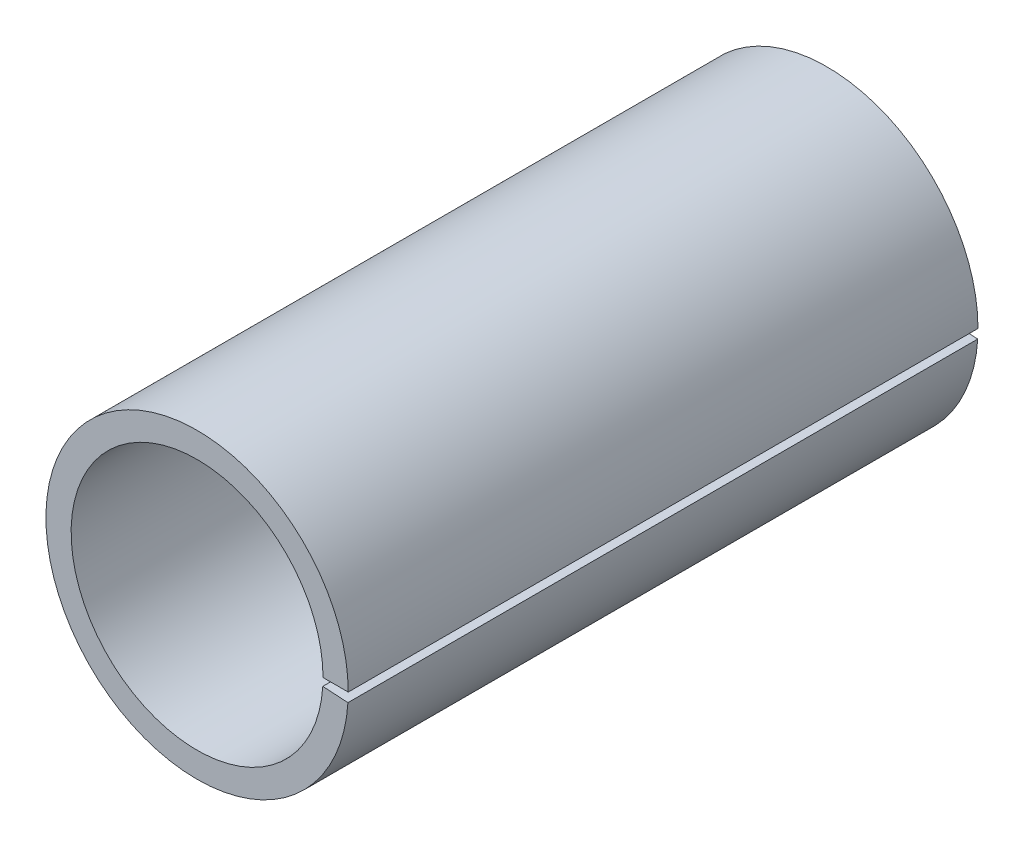
ISO-10303-21;
HEADER;
FILE_DESCRIPTION(('STEP AP214'),'2;1');
FILE_NAME('part.step','',(''),(''),'','','');
FILE_SCHEMA(('AUTOMOTIVE_DESIGN { 1 0 10303 214 1 1 1 1 }'));
ENDSEC;
DATA;
#1=APPLICATION_CONTEXT('core data for automotive mechanical design processes');
#2=APPLICATION_PROTOCOL_DEFINITION('international standard','automotive_design',2000,#1);
#3=PRODUCT_CONTEXT('',#1,'mechanical');
#4=PRODUCT('Part','Part','',(#3));
#5=PRODUCT_RELATED_PRODUCT_CATEGORY('part','',(#4));
#6=PRODUCT_DEFINITION_FORMATION('','',#4);
#7=PRODUCT_DEFINITION_CONTEXT('part definition',#1,'design');
#8=PRODUCT_DEFINITION('design','',#6,#7);
#9=PRODUCT_DEFINITION_SHAPE('','',#8);
#10=(LENGTH_UNIT() NAMED_UNIT(*) SI_UNIT(.MILLI.,.METRE.));
#11=(NAMED_UNIT(*) PLANE_ANGLE_UNIT() SI_UNIT($,.RADIAN.));
#12=(NAMED_UNIT(*) SI_UNIT($,.STERADIAN.) SOLID_ANGLE_UNIT());
#13=UNCERTAINTY_MEASURE_WITH_UNIT(LENGTH_MEASURE(1.E-05),#10,'distance_accuracy_value','');
#14=(GEOMETRIC_REPRESENTATION_CONTEXT(3) GLOBAL_UNCERTAINTY_ASSIGNED_CONTEXT((#13)) GLOBAL_UNIT_ASSIGNED_CONTEXT((#10,
#11,#12)) REPRESENTATION_CONTEXT('',''));
#15=CARTESIAN_POINT('',(0.,0.,0.));
#16=DIRECTION('',(0.,0.,1.));
#17=DIRECTION('',(1.,0.,0.));
#18=AXIS2_PLACEMENT_3D('',#15,#16,#17);
#19=CARTESIAN_POINT('',(0.,0.,25.));
#20=DIRECTION('',(0.,0.,1.));
#21=DIRECTION('',(1.,0.,0.));
#22=AXIS2_PLACEMENT_3D('',#19,#20,#21);
#23=PLANE('',#22);
#24=DIRECTION('',(0.998108793977972,-0.0614722326244827,0.));
#25=VECTOR('',#24,1.);
#26=CARTESIAN_POINT('',(0.,0.,25.));
#27=LINE('',#26,#25);
#28=CARTESIAN_POINT('',(4.99054396988986,-0.307361163122413,25.));
#29=VERTEX_POINT('',#28);
#30=CARTESIAN_POINT('',(5.98865276386783,-0.368833395746894,25.));
#31=VERTEX_POINT('',#30);
#32=EDGE_CURVE('E78',#29,#31,#27,.T.);
#33=ORIENTED_EDGE('',*,*,#32,.F.);
#34=CARTESIAN_POINT('',(0.,0.,25.));
#35=DIRECTION('',(0.,0.,1.));
#36=DIRECTION('',(1.,0.,0.));
#37=AXIS2_PLACEMENT_3D('',#34,#35,#36);
#38=CIRCLE('',#37,5.);
#39=CARTESIAN_POINT('',(5.,0.,25.));
#40=VERTEX_POINT('',#39);
#41=EDGE_CURVE('E102',#40,#29,#38,.T.);
#42=ORIENTED_EDGE('',*,*,#41,.F.);
#43=DIRECTION('',(-1.,0.,0.));
#44=VECTOR('',#43,1.);
#45=CARTESIAN_POINT('',(0.,0.,25.));
#46=LINE('',#45,#44);
#47=CARTESIAN_POINT('',(6.,0.,25.));
#48=VERTEX_POINT('',#47);
#49=EDGE_CURVE('E62',#48,#40,#46,.T.);
#50=ORIENTED_EDGE('',*,*,#49,.F.);
#51=CARTESIAN_POINT('',(0.,0.,25.));
#52=DIRECTION('',(0.,0.,1.));
#53=DIRECTION('',(1.,0.,0.));
#54=AXIS2_PLACEMENT_3D('',#51,#52,#53);
#55=CIRCLE('',#54,6.);
#56=EDGE_CURVE('E92',#48,#31,#55,.T.);
#57=ORIENTED_EDGE('',*,*,#56,.T.);
#58=EDGE_LOOP('',(#33,#42,#50,#57));
#59=FACE_BOUND('',#58,.T.);
#60=ADVANCED_FACE('F39',(#59),#23,.T.);
#61=CARTESIAN_POINT('',(0.,0.,0.));
#62=DIRECTION('',(0.,0.,1.));
#63=DIRECTION('',(1.,0.,0.));
#64=AXIS2_PLACEMENT_3D('',#61,#62,#63);
#65=PLANE('',#64);
#66=CARTESIAN_POINT('',(0.,0.,0.));
#67=DIRECTION('',(0.,0.,1.));
#68=DIRECTION('',(1.,0.,0.));
#69=AXIS2_PLACEMENT_3D('',#66,#67,#68);
#70=CIRCLE('',#69,5.);
#71=CARTESIAN_POINT('',(5.,0.,0.));
#72=VERTEX_POINT('',#71);
#73=CARTESIAN_POINT('',(4.99054396988986,-0.307361163122413,0.));
#74=VERTEX_POINT('',#73);
#75=EDGE_CURVE('E105',#72,#74,#70,.T.);
#76=ORIENTED_EDGE('',*,*,#75,.T.);
#77=DIRECTION('',(0.998108793977972,-0.0614722326244827,0.));
#78=VECTOR('',#77,1.);
#79=CARTESIAN_POINT('',(0.,0.,0.));
#80=LINE('',#79,#78);
#81=CARTESIAN_POINT('',(5.98865276386783,-0.368833395746894,0.));
#82=VERTEX_POINT('',#81);
#83=EDGE_CURVE('E54',#74,#82,#80,.T.);
#84=ORIENTED_EDGE('',*,*,#83,.T.);
#85=CARTESIAN_POINT('',(0.,0.,0.));
#86=DIRECTION('',(0.,0.,1.));
#87=DIRECTION('',(1.,0.,0.));
#88=AXIS2_PLACEMENT_3D('',#85,#86,#87);
#89=CIRCLE('',#88,6.);
#90=CARTESIAN_POINT('',(6.,0.,0.));
#91=VERTEX_POINT('',#90);
#92=EDGE_CURVE('E94',#91,#82,#89,.T.);
#93=ORIENTED_EDGE('',*,*,#92,.F.);
#94=DIRECTION('',(-1.,0.,0.));
#95=VECTOR('',#94,1.);
#96=CARTESIAN_POINT('',(0.,0.,0.));
#97=LINE('',#96,#95);
#98=EDGE_CURVE('E113',#91,#72,#97,.T.);
#99=ORIENTED_EDGE('',*,*,#98,.T.);
#100=EDGE_LOOP('',(#76,#84,#93,#99));
#101=FACE_BOUND('',#100,.T.);
#102=ADVANCED_FACE('F122',(#101),#65,.F.);
#103=CARTESIAN_POINT('',(0.,0.,25.));
#104=DIRECTION('',(0.,0.,-1.));
#105=DIRECTION('',(-1.,0.,0.));
#106=AXIS2_PLACEMENT_3D('',#103,#104,#105);
#107=CYLINDRICAL_SURFACE('',#106,6.);
#108=ORIENTED_EDGE('',*,*,#92,.T.);
#109=DIRECTION('',(0.,0.,1.));
#110=VECTOR('',#109,1.);
#111=CARTESIAN_POINT('',(5.98865276386783,-0.368833395746894,-5.));
#112=LINE('',#111,#110);
#113=EDGE_CURVE('E81',#82,#31,#112,.T.);
#114=ORIENTED_EDGE('',*,*,#113,.T.);
#115=ORIENTED_EDGE('',*,*,#56,.F.);
#116=DIRECTION('',(0.,0.,1.));
#117=VECTOR('',#116,1.);
#118=CARTESIAN_POINT('',(6.,0.,-5.));
#119=LINE('',#118,#117);
#120=EDGE_CURVE('E96',#91,#48,#119,.T.);
#121=ORIENTED_EDGE('',*,*,#120,.F.);
#122=EDGE_LOOP('',(#108,#114,#115,#121));
#123=FACE_BOUND('',#122,.T.);
#124=ADVANCED_FACE('F41',(#123),#107,.T.);
#125=CARTESIAN_POINT('',(0.,0.,25.));
#126=DIRECTION('',(0.,0.,-1.));
#127=DIRECTION('',(-1.,0.,0.));
#128=AXIS2_PLACEMENT_3D('',#125,#126,#127);
#129=CYLINDRICAL_SURFACE('',#128,5.);
#130=DIRECTION('',(0.,0.,-1.));
#131=VECTOR('',#130,1.);
#132=CARTESIAN_POINT('',(4.99054396988986,-0.307361163122413,25.));
#133=LINE('',#132,#131);
#134=EDGE_CURVE('E11',#74,#29,#133,.F.);
#135=ORIENTED_EDGE('',*,*,#134,.F.);
#136=ORIENTED_EDGE('',*,*,#75,.F.);
#137=DIRECTION('',(0.,0.,-1.));
#138=VECTOR('',#137,1.);
#139=CARTESIAN_POINT('',(5.,0.,25.));
#140=LINE('',#139,#138);
#141=EDGE_CURVE('E48',#40,#72,#140,.T.);
#142=ORIENTED_EDGE('',*,*,#141,.F.);
#143=ORIENTED_EDGE('',*,*,#41,.T.);
#144=EDGE_LOOP('',(#135,#136,#142,#143));
#145=FACE_BOUND('',#144,.T.);
#146=ADVANCED_FACE('F125',(#145),#129,.F.);
#147=CARTESIAN_POINT('',(0.,0.,-5.));
#148=DIRECTION('',(0.,1.,0.));
#149=DIRECTION('',(0.,0.,1.));
#150=AXIS2_PLACEMENT_3D('',#147,#148,#149);
#151=PLANE('',#150);
#152=ORIENTED_EDGE('',*,*,#120,.T.);
#153=ORIENTED_EDGE('',*,*,#49,.T.);
#154=ORIENTED_EDGE('',*,*,#141,.T.);
#155=ORIENTED_EDGE('',*,*,#98,.F.);
#156=EDGE_LOOP('',(#152,#153,#154,#155));
#157=FACE_BOUND('',#156,.T.);
#158=ADVANCED_FACE('F120',(#157),#151,.F.);
#159=CARTESIAN_POINT('',(0.,0.,-5.));
#160=DIRECTION('',(-0.0614722326244827,-0.998108793977972,0.));
#161=DIRECTION('',(0.998108793977972,-0.0614722326244827,0.));
#162=AXIS2_PLACEMENT_3D('',#159,#160,#161);
#163=PLANE('',#162);
#164=ORIENTED_EDGE('',*,*,#134,.T.);
#165=ORIENTED_EDGE('',*,*,#32,.T.);
#166=ORIENTED_EDGE('',*,*,#113,.F.);
#167=ORIENTED_EDGE('',*,*,#83,.F.);
#168=EDGE_LOOP('',(#164,#165,#166,#167));
#169=FACE_BOUND('',#168,.T.);
#170=ADVANCED_FACE('F80',(#169),#163,.F.);
#171=CLOSED_SHELL('',(#60,#102,#124,#146,#158,#170));
#172=MANIFOLD_SOLID_BREP('B2',#171);
#173=ADVANCED_BREP_SHAPE_REPRESENTATION('',(#18,#172),#14);
#174=SHAPE_DEFINITION_REPRESENTATION(#9,#173);
ENDSEC;
END-ISO-10303-21;
